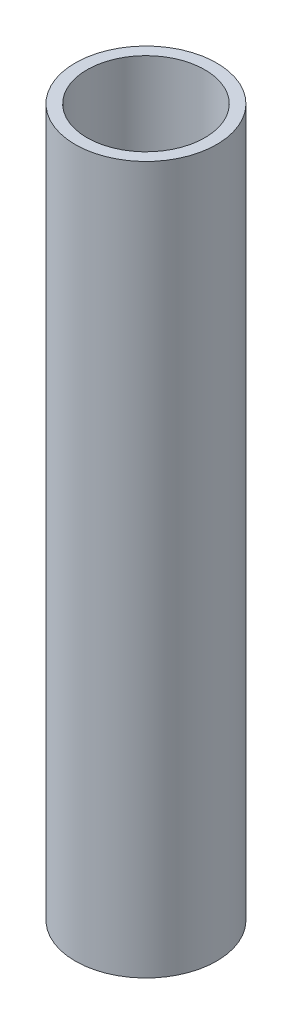
ISO-10303-21;
HEADER;
FILE_DESCRIPTION(('STEP AP214'),'2;1');
FILE_NAME('part.step','',(''),(''),'','','');
FILE_SCHEMA(('AUTOMOTIVE_DESIGN { 1 0 10303 214 1 1 1 1 }'));
ENDSEC;
DATA;
#1=APPLICATION_CONTEXT('core data for automotive mechanical design processes');
#2=APPLICATION_PROTOCOL_DEFINITION('international standard','automotive_design',2000,#1);
#3=PRODUCT_CONTEXT('',#1,'mechanical');
#4=PRODUCT('Part','Part','',(#3));
#5=PRODUCT_RELATED_PRODUCT_CATEGORY('part','',(#4));
#6=PRODUCT_DEFINITION_FORMATION('','',#4);
#7=PRODUCT_DEFINITION_CONTEXT('part definition',#1,'design');
#8=PRODUCT_DEFINITION('design','',#6,#7);
#9=PRODUCT_DEFINITION_SHAPE('','',#8);
#10=(LENGTH_UNIT() NAMED_UNIT(*) SI_UNIT(.MILLI.,.METRE.));
#11=(NAMED_UNIT(*) PLANE_ANGLE_UNIT() SI_UNIT($,.RADIAN.));
#12=(NAMED_UNIT(*) SI_UNIT($,.STERADIAN.) SOLID_ANGLE_UNIT());
#13=UNCERTAINTY_MEASURE_WITH_UNIT(LENGTH_MEASURE(1.E-05),#10,'distance_accuracy_value','');
#14=(GEOMETRIC_REPRESENTATION_CONTEXT(3) GLOBAL_UNCERTAINTY_ASSIGNED_CONTEXT((#13)) GLOBAL_UNIT_ASSIGNED_CONTEXT((#10,
#11,#12)) REPRESENTATION_CONTEXT('',''));
#15=CARTESIAN_POINT('',(0.,0.,0.));
#16=DIRECTION('',(0.,0.,1.));
#17=DIRECTION('',(1.,0.,0.));
#18=AXIS2_PLACEMENT_3D('',#15,#16,#17);
#19=CARTESIAN_POINT('',(0.,30.,0.));
#20=DIRECTION('',(0.,-1.,0.));
#21=DIRECTION('',(0.,0.,-1.));
#22=AXIS2_PLACEMENT_3D('',#19,#20,#21);
#23=CYLINDRICAL_SURFACE('',#22,3.);
#24=CARTESIAN_POINT('',(0.,30.,0.));
#25=DIRECTION('',(0.,1.,0.));
#26=DIRECTION('',(0.,0.,1.));
#27=AXIS2_PLACEMENT_3D('',#24,#25,#26);
#28=CIRCLE('',#27,3.);
#29=CARTESIAN_POINT('',(0.,30.,3.));
#30=VERTEX_POINT('',#29);
#31=EDGE_CURVE('E10',#30,#30,#28,.T.);
#32=ORIENTED_EDGE('',*,*,#31,.F.);
#33=EDGE_LOOP('',(#32));
#34=FACE_BOUND('',#33,.T.);
#35=CARTESIAN_POINT('',(0.,0.,0.));
#36=DIRECTION('',(0.,1.,0.));
#37=DIRECTION('',(0.,0.,1.));
#38=AXIS2_PLACEMENT_3D('',#35,#36,#37);
#39=CIRCLE('',#38,3.);
#40=CARTESIAN_POINT('',(0.,0.,3.));
#41=VERTEX_POINT('',#40);
#42=EDGE_CURVE('E40',#41,#41,#39,.T.);
#43=ORIENTED_EDGE('',*,*,#42,.T.);
#44=EDGE_LOOP('',(#43));
#45=FACE_BOUND('',#44,.T.);
#46=ADVANCED_FACE('F37',(#34,#45),#23,.T.);
#47=CARTESIAN_POINT('',(0.,30.,0.));
#48=DIRECTION('',(0.,1.,0.));
#49=DIRECTION('',(0.,0.,1.));
#50=AXIS2_PLACEMENT_3D('',#47,#48,#49);
#51=PLANE('',#50);
#52=CARTESIAN_POINT('',(0.,30.,0.));
#53=DIRECTION('',(0.,1.,0.));
#54=DIRECTION('',(0.,0.,1.));
#55=AXIS2_PLACEMENT_3D('',#52,#53,#54);
#56=CIRCLE('',#55,2.5);
#57=CARTESIAN_POINT('',(0.,30.,2.5));
#58=VERTEX_POINT('',#57);
#59=EDGE_CURVE('E49',#58,#58,#56,.T.);
#60=ORIENTED_EDGE('',*,*,#59,.F.);
#61=EDGE_LOOP('',(#60));
#62=FACE_BOUND('',#61,.T.);
#63=ORIENTED_EDGE('',*,*,#31,.T.);
#64=EDGE_LOOP('',(#63));
#65=FACE_BOUND('',#64,.T.);
#66=ADVANCED_FACE('F64',(#62,#65),#51,.T.);
#67=CARTESIAN_POINT('',(0.,0.,0.));
#68=DIRECTION('',(0.,1.,0.));
#69=DIRECTION('',(0.,0.,1.));
#70=AXIS2_PLACEMENT_3D('',#67,#68,#69);
#71=PLANE('',#70);
#72=CARTESIAN_POINT('',(0.,0.,0.));
#73=DIRECTION('',(0.,1.,0.));
#74=DIRECTION('',(0.,0.,1.));
#75=AXIS2_PLACEMENT_3D('',#72,#73,#74);
#76=CIRCLE('',#75,2.5);
#77=CARTESIAN_POINT('',(0.,0.,2.5));
#78=VERTEX_POINT('',#77);
#79=EDGE_CURVE('E47',#78,#78,#76,.T.);
#80=ORIENTED_EDGE('',*,*,#79,.T.);
#81=EDGE_LOOP('',(#80));
#82=FACE_BOUND('',#81,.T.);
#83=ORIENTED_EDGE('',*,*,#42,.F.);
#84=EDGE_LOOP('',(#83));
#85=FACE_BOUND('',#84,.T.);
#86=ADVANCED_FACE('F55',(#82,#85),#71,.F.);
#87=CARTESIAN_POINT('',(0.,0.,0.));
#88=DIRECTION('',(0.,1.,0.));
#89=DIRECTION('',(0.,0.,1.));
#90=AXIS2_PLACEMENT_3D('',#87,#88,#89);
#91=CYLINDRICAL_SURFACE('',#90,2.5);
#92=ORIENTED_EDGE('',*,*,#79,.F.);
#93=EDGE_LOOP('',(#92));
#94=FACE_BOUND('',#93,.T.);
#95=ORIENTED_EDGE('',*,*,#59,.T.);
#96=EDGE_LOOP('',(#95));
#97=FACE_BOUND('',#96,.T.);
#98=ADVANCED_FACE('F58',(#94,#97),#91,.F.);
#99=CLOSED_SHELL('',(#46,#66,#86,#98));
#100=MANIFOLD_SOLID_BREP('B2',#99);
#101=ADVANCED_BREP_SHAPE_REPRESENTATION('',(#18,#100),#14);
#102=SHAPE_DEFINITION_REPRESENTATION(#9,#101);
ENDSEC;
END-ISO-10303-21;
